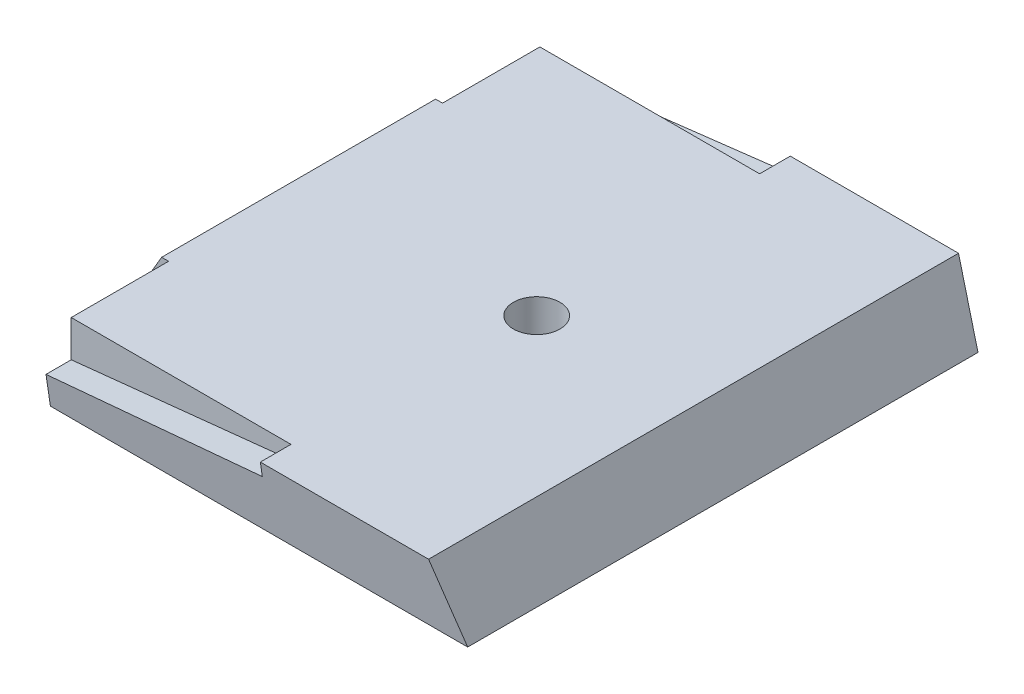
ISO-10303-21;
HEADER;
FILE_DESCRIPTION(('STEP AP214'),'2;1');
FILE_NAME('part.step','',(''),(''),'','','');
FILE_SCHEMA(('AUTOMOTIVE_DESIGN { 1 0 10303 214 1 1 1 1 }'));
ENDSEC;
DATA;
#1=APPLICATION_CONTEXT('core data for automotive mechanical design processes');
#2=APPLICATION_PROTOCOL_DEFINITION('international standard','automotive_design',2000,#1);
#3=PRODUCT_CONTEXT('',#1,'mechanical');
#4=PRODUCT('Part','Part','',(#3));
#5=PRODUCT_RELATED_PRODUCT_CATEGORY('part','',(#4));
#6=PRODUCT_DEFINITION_FORMATION('','',#4);
#7=PRODUCT_DEFINITION_CONTEXT('part definition',#1,'design');
#8=PRODUCT_DEFINITION('design','',#6,#7);
#9=PRODUCT_DEFINITION_SHAPE('','',#8);
#10=(LENGTH_UNIT() NAMED_UNIT(*) SI_UNIT(.MILLI.,.METRE.));
#11=(NAMED_UNIT(*) PLANE_ANGLE_UNIT() SI_UNIT($,.RADIAN.));
#12=(NAMED_UNIT(*) SI_UNIT($,.STERADIAN.) SOLID_ANGLE_UNIT());
#13=UNCERTAINTY_MEASURE_WITH_UNIT(LENGTH_MEASURE(1.E-05),#10,'distance_accuracy_value','');
#14=(GEOMETRIC_REPRESENTATION_CONTEXT(3) GLOBAL_UNCERTAINTY_ASSIGNED_CONTEXT((#13)) GLOBAL_UNIT_ASSIGNED_CONTEXT((#10,
#11,#12)) REPRESENTATION_CONTEXT('',''));
#15=CARTESIAN_POINT('',(0.,0.,0.));
#16=DIRECTION('',(0.,0.,1.));
#17=DIRECTION('',(1.,0.,0.));
#18=AXIS2_PLACEMENT_3D('',#15,#16,#17);
#19=CARTESIAN_POINT('',(-25.415,9.061,36.175));
#20=DIRECTION('',(0.,-1.,0.));
#21=DIRECTION('',(0.,0.,-1.));
#22=AXIS2_PLACEMENT_3D('',#19,#20,#21);
#23=CYLINDRICAL_SURFACE('',#22,3.175);
#24=CARTESIAN_POINT('',(-25.415,9.06,36.175));
#25=DIRECTION('',(0.,-1.,0.));
#26=DIRECTION('',(0.,0.,-1.));
#27=AXIS2_PLACEMENT_3D('',#24,#25,#26);
#28=CIRCLE('',#27,3.175);
#29=CARTESIAN_POINT('',(-25.415,9.06,33.));
#30=VERTEX_POINT('',#29);
#31=EDGE_CURVE('E242',#30,#30,#28,.F.);
#32=ORIENTED_EDGE('',*,*,#31,.T.);
#33=EDGE_LOOP('',(#32));
#34=FACE_BOUND('',#33,.T.);
#35=CARTESIAN_POINT('',(-25.415,4.3,36.175));
#36=DIRECTION('',(0.,-1.,0.));
#37=DIRECTION('',(0.,0.,-1.));
#38=AXIS2_PLACEMENT_3D('',#35,#36,#37);
#39=CIRCLE('',#38,3.175);
#40=CARTESIAN_POINT('',(-25.415,4.3,33.));
#41=VERTEX_POINT('',#40);
#42=EDGE_CURVE('E210',#41,#41,#39,.T.);
#43=ORIENTED_EDGE('',*,*,#42,.T.);
#44=EDGE_LOOP('',(#43));
#45=FACE_BOUND('',#44,.T.);
#46=ADVANCED_FACE('F39',(#34,#45),#23,.F.);
#47=CARTESIAN_POINT('',(0.,9.06,0.));
#48=DIRECTION('',(0.,-1.,0.));
#49=DIRECTION('',(0.,0.,-1.));
#50=AXIS2_PLACEMENT_3D('',#47,#48,#49);
#51=PLANE('',#50);
#52=ORIENTED_EDGE('',*,*,#31,.F.);
#53=EDGE_LOOP('',(#52));
#54=FACE_BOUND('',#53,.T.);
#55=DIRECTION('',(1.,0.,0.));
#56=VECTOR('',#55,1.);
#57=CARTESIAN_POINT('',(0.,9.06,72.35));
#58=LINE('',#57,#56);
#59=CARTESIAN_POINT('',(-26.97,9.06,72.35));
#60=VERTEX_POINT('',#59);
#61=CARTESIAN_POINT('',(-4.,9.06,72.35));
#62=VERTEX_POINT('',#61);
#63=EDGE_CURVE('E11',#60,#62,#58,.T.);
#64=ORIENTED_EDGE('',*,*,#63,.T.);
#65=DIRECTION('',(0.,0.,1.));
#66=VECTOR('',#65,1.);
#67=CARTESIAN_POINT('',(-4.,9.06,-0.001000000000001));
#68=LINE('',#67,#66);
#69=CARTESIAN_POINT('',(-4.,9.06,0.));
#70=VERTEX_POINT('',#69);
#71=EDGE_CURVE('E273',#70,#62,#68,.T.);
#72=ORIENTED_EDGE('',*,*,#71,.F.);
#73=DIRECTION('',(-1.,0.,0.));
#74=VECTOR('',#73,1.);
#75=CARTESIAN_POINT('',(0.,9.06,0.));
#76=LINE('',#75,#74);
#77=CARTESIAN_POINT('',(-26.97,9.06,0.));
#78=VERTEX_POINT('',#77);
#79=EDGE_CURVE('E49',#70,#78,#76,.T.);
#80=ORIENTED_EDGE('',*,*,#79,.T.);
#81=DIRECTION('',(0.,0.,-1.));
#82=VECTOR('',#81,1.);
#83=CARTESIAN_POINT('',(-26.97,9.06,4.185));
#84=LINE('',#83,#82);
#85=CARTESIAN_POINT('',(-26.97,9.06,4.185));
#86=VERTEX_POINT('',#85);
#87=EDGE_CURVE('E306',#86,#78,#84,.T.);
#88=ORIENTED_EDGE('',*,*,#87,.F.);
#89=DIRECTION('',(-1.,0.,0.));
#90=VECTOR('',#89,1.);
#91=CARTESIAN_POINT('',(0.,9.06,4.185));
#92=LINE('',#91,#90);
#93=CARTESIAN_POINT('',(-56.97,9.06,4.18500000000001));
#94=VERTEX_POINT('',#93);
#95=EDGE_CURVE('E292',#86,#94,#92,.T.);
#96=ORIENTED_EDGE('',*,*,#95,.T.);
#97=DIRECTION('',(0.,0.,-1.));
#98=VECTOR('',#97,1.);
#99=CARTESIAN_POINT('',(-56.97,9.06,0.));
#100=LINE('',#99,#98);
#101=CARTESIAN_POINT('',(-56.97,9.06,17.475));
#102=VERTEX_POINT('',#101);
#103=EDGE_CURVE('E370',#102,#94,#100,.T.);
#104=ORIENTED_EDGE('',*,*,#103,.F.);
#105=DIRECTION('',(1.,0.,0.));
#106=VECTOR('',#105,1.);
#107=CARTESIAN_POINT('',(-63.22,9.06,17.475));
#108=LINE('',#107,#106);
#109=CARTESIAN_POINT('',(-57.92,9.06,17.475));
#110=VERTEX_POINT('',#109);
#111=EDGE_CURVE('E374',#110,#102,#108,.T.);
#112=ORIENTED_EDGE('',*,*,#111,.F.);
#113=DIRECTION('',(0.,0.,1.));
#114=VECTOR('',#113,1.);
#115=CARTESIAN_POINT('',(-57.92,9.06,-0.001000000000001));
#116=LINE('',#115,#114);
#117=CARTESIAN_POINT('',(-57.92,9.06,54.875));
#118=VERTEX_POINT('',#117);
#119=EDGE_CURVE('E367',#110,#118,#116,.T.);
#120=ORIENTED_EDGE('',*,*,#119,.T.);
#121=DIRECTION('',(-1.,0.,0.));
#122=VECTOR('',#121,1.);
#123=CARTESIAN_POINT('',(-63.22,9.06,54.875));
#124=LINE('',#123,#122);
#125=CARTESIAN_POINT('',(-56.97,9.06,54.875));
#126=VERTEX_POINT('',#125);
#127=EDGE_CURVE('E364',#126,#118,#124,.T.);
#128=ORIENTED_EDGE('',*,*,#127,.F.);
#129=DIRECTION('',(0.,0.,-1.));
#130=VECTOR('',#129,1.);
#131=CARTESIAN_POINT('',(-56.97,9.06,72.35));
#132=LINE('',#131,#130);
#133=CARTESIAN_POINT('',(-56.97,9.06,68.165));
#134=VERTEX_POINT('',#133);
#135=EDGE_CURVE('E349',#134,#126,#132,.T.);
#136=ORIENTED_EDGE('',*,*,#135,.F.);
#137=DIRECTION('',(-1.,0.,0.));
#138=VECTOR('',#137,1.);
#139=CARTESIAN_POINT('',(-26.97,9.06,68.165));
#140=LINE('',#139,#138);
#141=CARTESIAN_POINT('',(-26.97,9.06,68.165));
#142=VERTEX_POINT('',#141);
#143=EDGE_CURVE('E318',#142,#134,#140,.T.);
#144=ORIENTED_EDGE('',*,*,#143,.F.);
#145=DIRECTION('',(0.,0.,1.));
#146=VECTOR('',#145,1.);
#147=CARTESIAN_POINT('',(-26.97,9.06,68.165));
#148=LINE('',#147,#146);
#149=EDGE_CURVE('E334',#142,#60,#148,.T.);
#150=ORIENTED_EDGE('',*,*,#149,.T.);
#151=EDGE_LOOP('',(#64,#72,#80,#88,#96,#104,#112,#120,#128,#136,#144,#150));
#152=FACE_BOUND('',#151,.T.);
#153=ADVANCED_FACE('F416',(#54,#152),#51,.F.);
#154=CARTESIAN_POINT('',(-56.97,9.061,0.));
#155=DIRECTION('',(1.,0.,0.));
#156=DIRECTION('',(0.,0.,-1.));
#157=AXIS2_PLACEMENT_3D('',#154,#155,#156);
#158=PLANE('',#157);
#159=DIRECTION('',(0.,0.,-1.));
#160=VECTOR('',#159,1.);
#161=CARTESIAN_POINT('',(-56.97,4.06,4.18500000000001));
#162=LINE('',#161,#160);
#163=CARTESIAN_POINT('',(-56.97,4.06,4.18500000000001));
#164=VERTEX_POINT('',#163);
#165=CARTESIAN_POINT('',(-56.97,4.06,0.739514348785872));
#166=VERTEX_POINT('',#165);
#167=EDGE_CURVE('E314',#164,#166,#162,.T.);
#168=ORIENTED_EDGE('',*,*,#167,.T.);
#169=DIRECTION('',(0.,0.989238608351861,-0.146311229049834));
#170=VECTOR('',#169,1.);
#171=CARTESIAN_POINT('',(-56.97,0.,1.34));
#172=LINE('',#171,#170);
#173=CARTESIAN_POINT('',(-56.97,0.,1.34));
#174=VERTEX_POINT('',#173);
#175=EDGE_CURVE('E280',#174,#166,#172,.T.);
#176=ORIENTED_EDGE('',*,*,#175,.F.);
#177=DIRECTION('',(0.,0.,1.));
#178=VECTOR('',#177,1.);
#179=CARTESIAN_POINT('',(-56.97,0.,0.));
#180=LINE('',#179,#178);
#181=CARTESIAN_POINT('',(-56.97,0.,17.475));
#182=VERTEX_POINT('',#181);
#183=EDGE_CURVE('E377',#174,#182,#180,.T.);
#184=ORIENTED_EDGE('',*,*,#183,.T.);
#185=DIRECTION('',(0.,-1.,0.));
#186=VECTOR('',#185,1.);
#187=CARTESIAN_POINT('',(-56.97,9.061,17.475));
#188=LINE('',#187,#186);
#189=EDGE_CURVE('E350',#102,#182,#188,.T.);
#190=ORIENTED_EDGE('',*,*,#189,.F.);
#191=ORIENTED_EDGE('',*,*,#103,.T.);
#192=DIRECTION('',(0.,-1.,0.));
#193=VECTOR('',#192,1.);
#194=CARTESIAN_POINT('',(-56.97,9.06,4.18500000000001));
#195=LINE('',#194,#193);
#196=EDGE_CURVE('E296',#94,#164,#195,.T.);
#197=ORIENTED_EDGE('',*,*,#196,.T.);
#198=EDGE_LOOP('',(#168,#176,#184,#190,#191,#197));
#199=FACE_BOUND('',#198,.T.);
#200=ADVANCED_FACE('F424',(#199),#158,.F.);
#201=CARTESIAN_POINT('',(0.,0.,0.));
#202=DIRECTION('',(0.,-1.,0.));
#203=DIRECTION('',(0.,0.,-1.));
#204=AXIS2_PLACEMENT_3D('',#201,#202,#203);
#205=PLANE('',#204);
#206=DIRECTION('',(-0.504646110307462,0.,0.863326301783716));
#207=VECTOR('',#206,1.);
#208=CARTESIAN_POINT('',(-19.0642387182163,0.,36.2091244066578));
#209=LINE('',#208,#207);
#210=CARTESIAN_POINT('',(-19.0642387182163,0.,36.2091244066578));
#211=VERTEX_POINT('',#210);
#212=CARTESIAN_POINT('',(-22.2691719621629,0.,41.6919828067242));
#213=VERTEX_POINT('',#212);
#214=EDGE_CURVE('E57',#211,#213,#209,.T.);
#215=ORIENTED_EDGE('',*,*,#214,.F.);
#216=DIRECTION('',(0.495339453946238,0.,0.868699502339125));
#217=VECTOR('',#216,1.);
#218=CARTESIAN_POINT('',(-22.2100667560534,0.,30.6921415999336));
#219=LINE('',#218,#217);
#220=CARTESIAN_POINT('',(-22.2100667560534,0.,30.6921415999336));
#221=VERTEX_POINT('',#220);
#222=EDGE_CURVE('E203',#221,#211,#219,.T.);
#223=ORIENTED_EDGE('',*,*,#222,.F.);
#224=DIRECTION('',(0.9999855642537,0.,0.00537320055540869));
#225=VECTOR('',#224,1.);
#226=CARTESIAN_POINT('',(-28.5608280378371,0.,30.6580171932758));
#227=LINE('',#226,#225);
#228=CARTESIAN_POINT('',(-28.5608280378371,0.,30.6580171932758));
#229=VERTEX_POINT('',#228);
#230=EDGE_CURVE('E207',#229,#221,#227,.T.);
#231=ORIENTED_EDGE('',*,*,#230,.F.);
#232=DIRECTION('',(0.504646110307462,0.,-0.863326301783716));
#233=VECTOR('',#232,1.);
#234=CARTESIAN_POINT('',(-31.7657612817837,0.,36.1408755933422));
#235=LINE('',#234,#233);
#236=CARTESIAN_POINT('',(-31.7657612817837,0.,36.1408755933422));
#237=VERTEX_POINT('',#236);
#238=EDGE_CURVE('E232',#237,#229,#235,.T.);
#239=ORIENTED_EDGE('',*,*,#238,.F.);
#240=DIRECTION('',(-0.495339453946237,0.,-0.868699502339125));
#241=VECTOR('',#240,1.);
#242=CARTESIAN_POINT('',(-28.6199332439466,0.,41.6578584000664));
#243=LINE('',#242,#241);
#244=CARTESIAN_POINT('',(-28.6199332439466,0.,41.6578584000664));
#245=VERTEX_POINT('',#244);
#246=EDGE_CURVE('E228',#245,#237,#243,.T.);
#247=ORIENTED_EDGE('',*,*,#246,.F.);
#248=DIRECTION('',(-0.9999855642537,0.,-0.00537320055540814));
#249=VECTOR('',#248,1.);
#250=CARTESIAN_POINT('',(-22.2691719621629,0.,41.6919828067242));
#251=LINE('',#250,#249);
#252=EDGE_CURVE('E225',#213,#245,#251,.T.);
#253=ORIENTED_EDGE('',*,*,#252,.F.);
#254=EDGE_LOOP('',(#215,#223,#231,#239,#247,#253));
#255=FACE_BOUND('',#254,.T.);
#256=DIRECTION('',(-1.,0.,0.));
#257=VECTOR('',#256,1.);
#258=CARTESIAN_POINT('',(0.001000000000001,0.,71.01));
#259=LINE('',#258,#257);
#260=CARTESIAN_POINT('',(0.,0.,71.01));
#261=VERTEX_POINT('',#260);
#262=CARTESIAN_POINT('',(-56.97,0.,71.01));
#263=VERTEX_POINT('',#262);
#264=EDGE_CURVE('E65',#261,#263,#259,.T.);
#265=ORIENTED_EDGE('',*,*,#264,.T.);
#266=DIRECTION('',(0.,0.,1.));
#267=VECTOR('',#266,1.);
#268=CARTESIAN_POINT('',(-56.97,0.,72.35));
#269=LINE('',#268,#267);
#270=CARTESIAN_POINT('',(-56.97,0.,54.875));
#271=VERTEX_POINT('',#270);
#272=EDGE_CURVE('E357',#271,#263,#269,.T.);
#273=ORIENTED_EDGE('',*,*,#272,.F.);
#274=DIRECTION('',(1.,0.,0.));
#275=VECTOR('',#274,1.);
#276=CARTESIAN_POINT('',(-63.22,0.,54.875));
#277=LINE('',#276,#275);
#278=CARTESIAN_POINT('',(-63.22,0.,54.875));
#279=VERTEX_POINT('',#278);
#280=EDGE_CURVE('E353',#279,#271,#277,.T.);
#281=ORIENTED_EDGE('',*,*,#280,.F.);
#282=DIRECTION('',(0.,0.,1.));
#283=VECTOR('',#282,1.);
#284=CARTESIAN_POINT('',(-63.22,0.,0.));
#285=LINE('',#284,#283);
#286=CARTESIAN_POINT('',(-63.22,0.,17.475));
#287=VERTEX_POINT('',#286);
#288=EDGE_CURVE('E43',#287,#279,#285,.T.);
#289=ORIENTED_EDGE('',*,*,#288,.F.);
#290=DIRECTION('',(-1.,0.,0.));
#291=VECTOR('',#290,1.);
#292=CARTESIAN_POINT('',(-63.22,0.,17.475));
#293=LINE('',#292,#291);
#294=EDGE_CURVE('E380',#182,#287,#293,.T.);
#295=ORIENTED_EDGE('',*,*,#294,.F.);
#296=ORIENTED_EDGE('',*,*,#183,.F.);
#297=DIRECTION('',(-1.,0.,0.));
#298=VECTOR('',#297,1.);
#299=CARTESIAN_POINT('',(0.001000000000001,0.,1.34));
#300=LINE('',#299,#298);
#301=CARTESIAN_POINT('',(0.,0.,1.34));
#302=VERTEX_POINT('',#301);
#303=EDGE_CURVE('E283',#302,#174,#300,.T.);
#304=ORIENTED_EDGE('',*,*,#303,.F.);
#305=DIRECTION('',(0.,0.,-1.));
#306=VECTOR('',#305,1.);
#307=CARTESIAN_POINT('',(0.,0.,0.));
#308=LINE('',#307,#306);
#309=EDGE_CURVE('E389',#261,#302,#308,.T.);
#310=ORIENTED_EDGE('',*,*,#309,.F.);
#311=EDGE_LOOP('',(#265,#273,#281,#289,#295,#296,#304,#310));
#312=FACE_BOUND('',#311,.T.);
#313=ADVANCED_FACE('F41',(#255,#312),#205,.T.);
#314=CARTESIAN_POINT('',(-57.92,9.06,-0.001000000000001));
#315=DIRECTION('',(0.863156265610712,-0.504936888271167,0.));
#316=DIRECTION('',(0.504936888271167,0.863156265610713,0.));
#317=AXIS2_PLACEMENT_3D('',#314,#315,#316);
#318=PLANE('',#317);
#319=ORIENTED_EDGE('',*,*,#288,.T.);
#320=DIRECTION('',(-0.504936888271167,-0.863156265610713,0.));
#321=VECTOR('',#320,1.);
#322=CARTESIAN_POINT('',(-59.2708588445871,6.75079601283792,54.875));
#323=LINE('',#322,#321);
#324=EDGE_CURVE('E346',#118,#279,#323,.T.);
#325=ORIENTED_EDGE('',*,*,#324,.F.);
#326=ORIENTED_EDGE('',*,*,#119,.F.);
#327=DIRECTION('',(0.504936888271167,0.863156265610713,0.));
#328=VECTOR('',#327,1.);
#329=CARTESIAN_POINT('',(-59.2708588445871,6.75079601283793,17.475));
#330=LINE('',#329,#328);
#331=EDGE_CURVE('E338',#287,#110,#330,.T.);
#332=ORIENTED_EDGE('',*,*,#331,.F.);
#333=EDGE_LOOP('',(#319,#325,#326,#332));
#334=FACE_BOUND('',#333,.T.);
#335=ADVANCED_FACE('F403',(#334),#318,.F.);
#336=CARTESIAN_POINT('',(-63.22,9.061,17.475));
#337=DIRECTION('',(0.,0.,1.));
#338=DIRECTION('',(1.,0.,0.));
#339=AXIS2_PLACEMENT_3D('',#336,#337,#338);
#340=PLANE('',#339);
#341=ORIENTED_EDGE('',*,*,#111,.T.);
#342=ORIENTED_EDGE('',*,*,#189,.T.);
#343=ORIENTED_EDGE('',*,*,#294,.T.);
#344=ORIENTED_EDGE('',*,*,#331,.T.);
#345=EDGE_LOOP('',(#341,#342,#343,#344));
#346=FACE_BOUND('',#345,.T.);
#347=ADVANCED_FACE('F422',(#346),#340,.F.);
#348=CARTESIAN_POINT('',(-56.97,9.061,72.35));
#349=DIRECTION('',(1.,0.,0.));
#350=DIRECTION('',(0.,0.,-1.));
#351=AXIS2_PLACEMENT_3D('',#348,#349,#350);
#352=PLANE('',#351);
#353=ORIENTED_EDGE('',*,*,#272,.T.);
#354=DIRECTION('',(0.,-0.989238608351861,-0.146311229049833));
#355=VECTOR('',#354,1.);
#356=CARTESIAN_POINT('',(-56.97,0.,71.01));
#357=LINE('',#356,#355);
#358=CARTESIAN_POINT('',(-56.97,4.06,71.6104856512141));
#359=VERTEX_POINT('',#358);
#360=EDGE_CURVE('E261',#359,#263,#357,.T.);
#361=ORIENTED_EDGE('',*,*,#360,.F.);
#362=DIRECTION('',(0.,0.,1.));
#363=VECTOR('',#362,1.);
#364=CARTESIAN_POINT('',(-56.97,4.06,68.165));
#365=LINE('',#364,#363);
#366=CARTESIAN_POINT('',(-56.97,4.06,68.165));
#367=VERTEX_POINT('',#366);
#368=EDGE_CURVE('E333',#367,#359,#365,.T.);
#369=ORIENTED_EDGE('',*,*,#368,.F.);
#370=DIRECTION('',(0.,-1.,0.));
#371=VECTOR('',#370,1.);
#372=CARTESIAN_POINT('',(-56.97,9.06,68.165));
#373=LINE('',#372,#371);
#374=EDGE_CURVE('E321',#134,#367,#373,.T.);
#375=ORIENTED_EDGE('',*,*,#374,.F.);
#376=ORIENTED_EDGE('',*,*,#135,.T.);
#377=DIRECTION('',(0.,-1.,0.));
#378=VECTOR('',#377,1.);
#379=CARTESIAN_POINT('',(-56.97,9.061,54.875));
#380=LINE('',#379,#378);
#381=EDGE_CURVE('E361',#126,#271,#380,.T.);
#382=ORIENTED_EDGE('',*,*,#381,.T.);
#383=EDGE_LOOP('',(#353,#361,#369,#375,#376,#382));
#384=FACE_BOUND('',#383,.T.);
#385=ADVANCED_FACE('F446',(#384),#352,.F.);
#386=CARTESIAN_POINT('',(-63.22,9.061,54.875));
#387=DIRECTION('',(0.,0.,-1.));
#388=DIRECTION('',(-1.,0.,0.));
#389=AXIS2_PLACEMENT_3D('',#386,#387,#388);
#390=PLANE('',#389);
#391=ORIENTED_EDGE('',*,*,#127,.T.);
#392=ORIENTED_EDGE('',*,*,#324,.T.);
#393=ORIENTED_EDGE('',*,*,#280,.T.);
#394=ORIENTED_EDGE('',*,*,#381,.F.);
#395=EDGE_LOOP('',(#391,#392,#393,#394));
#396=FACE_BOUND('',#395,.T.);
#397=ADVANCED_FACE('F412',(#396),#390,.F.);
#398=CARTESIAN_POINT('',(-26.97,7.21,68.165));
#399=DIRECTION('',(1.,0.,0.));
#400=DIRECTION('',(0.,0.,-1.));
#401=AXIS2_PLACEMENT_3D('',#398,#399,#400);
#402=PLANE('',#401);
#403=DIRECTION('',(0.,0.,1.));
#404=VECTOR('',#403,1.);
#405=CARTESIAN_POINT('',(-26.97,7.21,68.165));
#406=LINE('',#405,#404);
#407=CARTESIAN_POINT('',(-26.97,7.21,68.165));
#408=VERTEX_POINT('',#407);
#409=CARTESIAN_POINT('',(-26.97,7.21,72.0763796909492));
#410=VERTEX_POINT('',#409);
#411=EDGE_CURVE('E339',#408,#410,#406,.T.);
#412=ORIENTED_EDGE('',*,*,#411,.T.);
#413=DIRECTION('',(0.,-0.989238608351861,-0.146311229049833));
#414=VECTOR('',#413,1.);
#415=CARTESIAN_POINT('',(-26.97,0.,71.01));
#416=LINE('',#415,#414);
#417=EDGE_CURVE('E270',#60,#410,#416,.T.);
#418=ORIENTED_EDGE('',*,*,#417,.F.);
#419=ORIENTED_EDGE('',*,*,#149,.F.);
#420=DIRECTION('',(0.,1.,0.));
#421=VECTOR('',#420,1.);
#422=CARTESIAN_POINT('',(-26.97,7.21,68.165));
#423=LINE('',#422,#421);
#424=EDGE_CURVE('E329',#408,#142,#423,.T.);
#425=ORIENTED_EDGE('',*,*,#424,.F.);
#426=EDGE_LOOP('',(#412,#418,#419,#425));
#427=FACE_BOUND('',#426,.T.);
#428=ADVANCED_FACE('F436',(#427),#402,.F.);
#429=CARTESIAN_POINT('',(-56.97,4.06,68.165));
#430=DIRECTION('',(0.104425930003996,-0.99453266670472,0.));
#431=DIRECTION('',(0.99453266670472,0.104425930003996,0.));
#432=AXIS2_PLACEMENT_3D('',#429,#430,#431);
#433=PLANE('',#432);
#434=ORIENTED_EDGE('',*,*,#368,.T.);
#435=DIRECTION('',(-0.994414067638051,-0.104413477101995,-0.0154430529047101));
#436=VECTOR('',#435,1.);
#437=CARTESIAN_POINT('',(-1.0644669267922,9.93008097268682,72.4786874727815));
#438=LINE('',#437,#436);
#439=EDGE_CURVE('E258',#410,#359,#438,.T.);
#440=ORIENTED_EDGE('',*,*,#439,.F.);
#441=ORIENTED_EDGE('',*,*,#411,.F.);
#442=DIRECTION('',(0.994532666704719,0.104425930003996,0.));
#443=VECTOR('',#442,1.);
#444=CARTESIAN_POINT('',(-56.97,4.06,68.165));
#445=LINE('',#444,#443);
#446=EDGE_CURVE('E325',#367,#408,#445,.T.);
#447=ORIENTED_EDGE('',*,*,#446,.F.);
#448=EDGE_LOOP('',(#434,#440,#441,#447));
#449=FACE_BOUND('',#448,.T.);
#450=ADVANCED_FACE('F439',(#449),#433,.F.);
#451=CARTESIAN_POINT('',(0.,0.,68.165));
#452=DIRECTION('',(0.,0.,1.));
#453=DIRECTION('',(1.,0.,0.));
#454=AXIS2_PLACEMENT_3D('',#451,#452,#453);
#455=PLANE('',#454);
#456=ORIENTED_EDGE('',*,*,#143,.T.);
#457=ORIENTED_EDGE('',*,*,#374,.T.);
#458=ORIENTED_EDGE('',*,*,#446,.T.);
#459=ORIENTED_EDGE('',*,*,#424,.T.);
#460=EDGE_LOOP('',(#456,#457,#458,#459));
#461=FACE_BOUND('',#460,.T.);
#462=ADVANCED_FACE('F441',(#461),#455,.T.);
#463=CARTESIAN_POINT('',(-0.101970030414678,10.0311431468065,4.185));
#464=DIRECTION('',(-0.104425930003996,0.994532666704719,0.));
#465=DIRECTION('',(-0.99453266670472,-0.104425930003996,0.));
#466=AXIS2_PLACEMENT_3D('',#463,#464,#465);
#467=PLANE('',#466);
#468=DIRECTION('',(-0.994414067638051,-0.104413477101995,0.0154430529047101));
#469=VECTOR('',#468,1.);
#470=CARTESIAN_POINT('',(-1.0644669267922,9.93008097268682,-0.128687472781494));
#471=LINE('',#470,#469);
#472=CARTESIAN_POINT('',(-26.97,7.21,0.273620309050773));
#473=VERTEX_POINT('',#472);
#474=EDGE_CURVE('E257',#473,#166,#471,.T.);
#475=ORIENTED_EDGE('',*,*,#474,.T.);
#476=ORIENTED_EDGE('',*,*,#167,.F.);
#477=DIRECTION('',(0.99453266670472,0.104425930003996,0.));
#478=VECTOR('',#477,1.);
#479=CARTESIAN_POINT('',(-0.101970030414678,10.0311431468065,4.185));
#480=LINE('',#479,#478);
#481=CARTESIAN_POINT('',(-26.97,7.21,4.185));
#482=VERTEX_POINT('',#481);
#483=EDGE_CURVE('E300',#164,#482,#480,.T.);
#484=ORIENTED_EDGE('',*,*,#483,.T.);
#485=DIRECTION('',(0.,0.,-1.));
#486=VECTOR('',#485,1.);
#487=CARTESIAN_POINT('',(-26.97,7.21,4.185));
#488=LINE('',#487,#486);
#489=EDGE_CURVE('E310',#482,#473,#488,.T.);
#490=ORIENTED_EDGE('',*,*,#489,.T.);
#491=EDGE_LOOP('',(#475,#476,#484,#490));
#492=FACE_BOUND('',#491,.T.);
#493=ADVANCED_FACE('F480',(#492),#467,.T.);
#494=CARTESIAN_POINT('',(-26.97,9.06,4.185));
#495=DIRECTION('',(-1.,0.,0.));
#496=DIRECTION('',(0.,0.,1.));
#497=AXIS2_PLACEMENT_3D('',#494,#495,#496);
#498=PLANE('',#497);
#499=DIRECTION('',(0.,-0.989238608351861,0.146311229049834));
#500=VECTOR('',#499,1.);
#501=CARTESIAN_POINT('',(-26.97,0.,1.34));
#502=LINE('',#501,#500);
#503=EDGE_CURVE('E262',#78,#473,#502,.T.);
#504=ORIENTED_EDGE('',*,*,#503,.T.);
#505=ORIENTED_EDGE('',*,*,#489,.F.);
#506=DIRECTION('',(0.,1.,0.));
#507=VECTOR('',#506,1.);
#508=CARTESIAN_POINT('',(-26.97,9.06,4.185));
#509=LINE('',#508,#507);
#510=EDGE_CURVE('E303',#482,#86,#509,.T.);
#511=ORIENTED_EDGE('',*,*,#510,.T.);
#512=ORIENTED_EDGE('',*,*,#87,.T.);
#513=EDGE_LOOP('',(#504,#505,#511,#512));
#514=FACE_BOUND('',#513,.T.);
#515=ADVANCED_FACE('F476',(#514),#498,.T.);
#516=CARTESIAN_POINT('',(0.,0.,4.185));
#517=DIRECTION('',(0.,0.,1.));
#518=DIRECTION('',(1.,0.,0.));
#519=AXIS2_PLACEMENT_3D('',#516,#517,#518);
#520=PLANE('',#519);
#521=ORIENTED_EDGE('',*,*,#95,.F.);
#522=ORIENTED_EDGE('',*,*,#510,.F.);
#523=ORIENTED_EDGE('',*,*,#483,.F.);
#524=ORIENTED_EDGE('',*,*,#196,.F.);
#525=EDGE_LOOP('',(#521,#522,#523,#524));
#526=FACE_BOUND('',#525,.T.);
#527=ADVANCED_FACE('F473',(#526),#520,.F.);
#528=CARTESIAN_POINT('',(0.,0.,-0.001000000000001));
#529=DIRECTION('',(-0.914808094886799,-0.403888783614481,0.));
#530=DIRECTION('',(0.403888783614481,-0.914808094886799,0.));
#531=AXIS2_PLACEMENT_3D('',#528,#529,#530);
#532=PLANE('',#531);
#533=ORIENTED_EDGE('',*,*,#71,.T.);
#534=DIRECTION('',(-0.400241819110182,0.906547720284562,0.13408100940191));
#535=VECTOR('',#534,1.);
#536=CARTESIAN_POINT('',(0.000160193513764849,-0.000362838308677382,71.0099463351729));
#537=LINE('',#536,#535);
#538=EDGE_CURVE('E267',#261,#62,#537,.T.);
#539=ORIENTED_EDGE('',*,*,#538,.F.);
#540=ORIENTED_EDGE('',*,*,#309,.T.);
#541=DIRECTION('',(0.400241819110182,-0.906547720284562,0.134081009401911));
#542=VECTOR('',#541,1.);
#543=CARTESIAN_POINT('',(0.000160193513764788,-0.000362838308677245,1.34005366482711));
#544=LINE('',#543,#542);
#545=EDGE_CURVE('E277',#70,#302,#544,.T.);
#546=ORIENTED_EDGE('',*,*,#545,.F.);
#547=EDGE_LOOP('',(#533,#539,#540,#546));
#548=FACE_BOUND('',#547,.T.);
#549=ADVANCED_FACE('F430',(#548),#532,.F.);
#550=CARTESIAN_POINT('',(0.001000000000001,0.,1.34));
#551=DIRECTION('',(0.,0.146311229049834,0.989238608351861));
#552=DIRECTION('',(0.,-0.989238608351861,0.146311229049834));
#553=AXIS2_PLACEMENT_3D('',#550,#551,#552);
#554=PLANE('',#553);
#555=ORIENTED_EDGE('',*,*,#503,.F.);
#556=ORIENTED_EDGE('',*,*,#79,.F.);
#557=ORIENTED_EDGE('',*,*,#545,.T.);
#558=ORIENTED_EDGE('',*,*,#303,.T.);
#559=ORIENTED_EDGE('',*,*,#175,.T.);
#560=ORIENTED_EDGE('',*,*,#474,.F.);
#561=EDGE_LOOP('',(#555,#556,#557,#558,#559,#560));
#562=FACE_BOUND('',#561,.T.);
#563=ADVANCED_FACE('F428',(#562),#554,.F.);
#564=CARTESIAN_POINT('',(0.001000000000001,0.,71.01));
#565=DIRECTION('',(0.,0.146311229049833,-0.989238608351861));
#566=DIRECTION('',(0.,0.989238608351861,0.146311229049833));
#567=AXIS2_PLACEMENT_3D('',#564,#565,#566);
#568=PLANE('',#567);
#569=ORIENTED_EDGE('',*,*,#417,.T.);
#570=ORIENTED_EDGE('',*,*,#439,.T.);
#571=ORIENTED_EDGE('',*,*,#360,.T.);
#572=ORIENTED_EDGE('',*,*,#264,.F.);
#573=ORIENTED_EDGE('',*,*,#538,.T.);
#574=ORIENTED_EDGE('',*,*,#63,.F.);
#575=EDGE_LOOP('',(#569,#570,#571,#572,#573,#574));
#576=FACE_BOUND('',#575,.T.);
#577=ADVANCED_FACE('F433',(#576),#568,.F.);
#578=CARTESIAN_POINT('',(-19.0642387182163,4.3,36.2091244066578));
#579=DIRECTION('',(0.863326301783716,0.,0.504646110307462));
#580=DIRECTION('',(0.504646110307462,0.,-0.863326301783716));
#581=AXIS2_PLACEMENT_3D('',#578,#579,#580);
#582=PLANE('',#581);
#583=ORIENTED_EDGE('',*,*,#214,.T.);
#584=DIRECTION('',(0.,-1.,0.));
#585=VECTOR('',#584,1.);
#586=CARTESIAN_POINT('',(-22.2691719621629,4.3,41.6919828067242));
#587=LINE('',#586,#585);
#588=CARTESIAN_POINT('',(-22.2691719621629,4.3,41.6919828067242));
#589=VERTEX_POINT('',#588);
#590=EDGE_CURVE('E177',#589,#213,#587,.T.);
#591=ORIENTED_EDGE('',*,*,#590,.F.);
#592=DIRECTION('',(-0.504646110307462,0.,0.863326301783716));
#593=VECTOR('',#592,1.);
#594=CARTESIAN_POINT('',(-19.0642387182163,4.3,36.2091244066578));
#595=LINE('',#594,#593);
#596=CARTESIAN_POINT('',(-19.0642387182163,4.3,36.2091244066578));
#597=VERTEX_POINT('',#596);
#598=EDGE_CURVE('E181',#597,#589,#595,.T.);
#599=ORIENTED_EDGE('',*,*,#598,.F.);
#600=DIRECTION('',(0.,-1.,0.));
#601=VECTOR('',#600,1.);
#602=CARTESIAN_POINT('',(-19.0642387182163,4.3,36.2091244066578));
#603=LINE('',#602,#601);
#604=EDGE_CURVE('E239',#597,#211,#603,.T.);
#605=ORIENTED_EDGE('',*,*,#604,.T.);
#606=EDGE_LOOP('',(#583,#591,#599,#605));
#607=FACE_BOUND('',#606,.T.);
#608=ADVANCED_FACE('F179',(#607),#582,.F.);
#609=CARTESIAN_POINT('',(-22.2100667560534,4.3,30.6921415999336));
#610=DIRECTION('',(0.868699502339125,0.,-0.495339453946238));
#611=DIRECTION('',(-0.495339453946238,0.,-0.868699502339125));
#612=AXIS2_PLACEMENT_3D('',#609,#610,#611);
#613=PLANE('',#612);
#614=ORIENTED_EDGE('',*,*,#222,.T.);
#615=ORIENTED_EDGE('',*,*,#604,.F.);
#616=DIRECTION('',(0.495339453946238,0.,0.868699502339125));
#617=VECTOR('',#616,1.);
#618=CARTESIAN_POINT('',(-22.2100667560534,4.3,30.6921415999336));
#619=LINE('',#618,#617);
#620=CARTESIAN_POINT('',(-22.2100667560534,4.3,30.6921415999336));
#621=VERTEX_POINT('',#620);
#622=EDGE_CURVE('E188',#621,#597,#619,.T.);
#623=ORIENTED_EDGE('',*,*,#622,.F.);
#624=DIRECTION('',(0.,-1.,0.));
#625=VECTOR('',#624,1.);
#626=CARTESIAN_POINT('',(-22.2100667560534,4.3,30.6921415999336));
#627=LINE('',#626,#625);
#628=EDGE_CURVE('E243',#621,#221,#627,.T.);
#629=ORIENTED_EDGE('',*,*,#628,.T.);
#630=EDGE_LOOP('',(#614,#615,#623,#629));
#631=FACE_BOUND('',#630,.T.);
#632=ADVANCED_FACE('F530',(#631),#613,.F.);
#633=CARTESIAN_POINT('',(-28.5608280378371,4.3,30.6580171932758));
#634=DIRECTION('',(0.00537320055540869,0.,-0.9999855642537));
#635=DIRECTION('',(-0.9999855642537,0.,-0.00537320055540869));
#636=AXIS2_PLACEMENT_3D('',#633,#634,#635);
#637=PLANE('',#636);
#638=ORIENTED_EDGE('',*,*,#230,.T.);
#639=ORIENTED_EDGE('',*,*,#628,.F.);
#640=DIRECTION('',(0.9999855642537,0.,0.00537320055540869));
#641=VECTOR('',#640,1.);
#642=CARTESIAN_POINT('',(-28.5608280378371,4.3,30.6580171932758));
#643=LINE('',#642,#641);
#644=CARTESIAN_POINT('',(-28.5608280378371,4.3,30.6580171932758));
#645=VERTEX_POINT('',#644);
#646=EDGE_CURVE('E218',#645,#621,#643,.T.);
#647=ORIENTED_EDGE('',*,*,#646,.F.);
#648=DIRECTION('',(0.,-1.,0.));
#649=VECTOR('',#648,1.);
#650=CARTESIAN_POINT('',(-28.5608280378371,4.3,30.6580171932758));
#651=LINE('',#650,#649);
#652=EDGE_CURVE('E246',#645,#229,#651,.T.);
#653=ORIENTED_EDGE('',*,*,#652,.T.);
#654=EDGE_LOOP('',(#638,#639,#647,#653));
#655=FACE_BOUND('',#654,.T.);
#656=ADVANCED_FACE('F537',(#655),#637,.F.);
#657=CARTESIAN_POINT('',(-31.7657612817837,4.3,36.1408755933422));
#658=DIRECTION('',(-0.863326301783716,0.,-0.504646110307462));
#659=DIRECTION('',(-0.504646110307462,0.,0.863326301783716));
#660=AXIS2_PLACEMENT_3D('',#657,#658,#659);
#661=PLANE('',#660);
#662=ORIENTED_EDGE('',*,*,#238,.T.);
#663=ORIENTED_EDGE('',*,*,#652,.F.);
#664=DIRECTION('',(0.504646110307462,0.,-0.863326301783716));
#665=VECTOR('',#664,1.);
#666=CARTESIAN_POINT('',(-31.7657612817837,4.3,36.1408755933422));
#667=LINE('',#666,#665);
#668=CARTESIAN_POINT('',(-31.7657612817837,4.3,36.1408755933422));
#669=VERTEX_POINT('',#668);
#670=EDGE_CURVE('E214',#669,#645,#667,.T.);
#671=ORIENTED_EDGE('',*,*,#670,.F.);
#672=DIRECTION('',(0.,-1.,0.));
#673=VECTOR('',#672,1.);
#674=CARTESIAN_POINT('',(-31.7657612817837,4.3,36.1408755933422));
#675=LINE('',#674,#673);
#676=EDGE_CURVE('E249',#669,#237,#675,.T.);
#677=ORIENTED_EDGE('',*,*,#676,.T.);
#678=EDGE_LOOP('',(#662,#663,#671,#677));
#679=FACE_BOUND('',#678,.T.);
#680=ADVANCED_FACE('F545',(#679),#661,.F.);
#681=CARTESIAN_POINT('',(-28.6199332439466,4.3,41.6578584000664));
#682=DIRECTION('',(-0.868699502339125,0.,0.495339453946237));
#683=DIRECTION('',(0.495339453946237,0.,0.868699502339125));
#684=AXIS2_PLACEMENT_3D('',#681,#682,#683);
#685=PLANE('',#684);
#686=ORIENTED_EDGE('',*,*,#246,.T.);
#687=ORIENTED_EDGE('',*,*,#676,.F.);
#688=DIRECTION('',(-0.495339453946237,0.,-0.868699502339125));
#689=VECTOR('',#688,1.);
#690=CARTESIAN_POINT('',(-28.6199332439466,4.3,41.6578584000664));
#691=LINE('',#690,#689);
#692=CARTESIAN_POINT('',(-28.6199332439466,4.3,41.6578584000664));
#693=VERTEX_POINT('',#692);
#694=EDGE_CURVE('E197',#693,#669,#691,.T.);
#695=ORIENTED_EDGE('',*,*,#694,.F.);
#696=DIRECTION('',(0.,-1.,0.));
#697=VECTOR('',#696,1.);
#698=CARTESIAN_POINT('',(-28.6199332439466,4.3,41.6578584000664));
#699=LINE('',#698,#697);
#700=EDGE_CURVE('E187',#693,#245,#699,.T.);
#701=ORIENTED_EDGE('',*,*,#700,.T.);
#702=EDGE_LOOP('',(#686,#687,#695,#701));
#703=FACE_BOUND('',#702,.T.);
#704=ADVANCED_FACE('F553',(#703),#685,.F.);
#705=CARTESIAN_POINT('',(-22.2691719621629,4.3,41.6919828067242));
#706=DIRECTION('',(-0.00537320055540814,0.,0.9999855642537));
#707=DIRECTION('',(0.9999855642537,0.,0.00537320055540814));
#708=AXIS2_PLACEMENT_3D('',#705,#706,#707);
#709=PLANE('',#708);
#710=ORIENTED_EDGE('',*,*,#252,.T.);
#711=ORIENTED_EDGE('',*,*,#700,.F.);
#712=DIRECTION('',(-0.9999855642537,0.,-0.00537320055540814));
#713=VECTOR('',#712,1.);
#714=CARTESIAN_POINT('',(-22.2691719621629,4.3,41.6919828067242));
#715=LINE('',#714,#713);
#716=EDGE_CURVE('E191',#589,#693,#715,.T.);
#717=ORIENTED_EDGE('',*,*,#716,.F.);
#718=ORIENTED_EDGE('',*,*,#590,.T.);
#719=EDGE_LOOP('',(#710,#711,#717,#718));
#720=FACE_BOUND('',#719,.T.);
#721=ADVANCED_FACE('F192',(#720),#709,.F.);
#722=CARTESIAN_POINT('',(0.,4.3,0.));
#723=DIRECTION('',(0.,-1.,0.));
#724=DIRECTION('',(0.,0.,-1.));
#725=AXIS2_PLACEMENT_3D('',#722,#723,#724);
#726=PLANE('',#725);
#727=ORIENTED_EDGE('',*,*,#42,.F.);
#728=EDGE_LOOP('',(#727));
#729=FACE_BOUND('',#728,.T.);
#730=ORIENTED_EDGE('',*,*,#598,.T.);
#731=ORIENTED_EDGE('',*,*,#716,.T.);
#732=ORIENTED_EDGE('',*,*,#694,.T.);
#733=ORIENTED_EDGE('',*,*,#670,.T.);
#734=ORIENTED_EDGE('',*,*,#646,.T.);
#735=ORIENTED_EDGE('',*,*,#622,.T.);
#736=EDGE_LOOP('',(#730,#731,#732,#733,#734,#735));
#737=FACE_BOUND('',#736,.T.);
#738=ADVANCED_FACE('F199',(#729,#737),#726,.T.);
#739=CLOSED_SHELL('',(#46,#153,#200,#313,#335,#347,#385,#397,#428,#450,#462,#493,#515,#527,#549,
#563,#577,#608,#632,#656,#680,#704,#721,#738));
#740=MANIFOLD_SOLID_BREP('B2',#739);
#741=ADVANCED_BREP_SHAPE_REPRESENTATION('',(#18,#740),#14);
#742=SHAPE_DEFINITION_REPRESENTATION(#9,#741);
ENDSEC;
END-ISO-10303-21;
